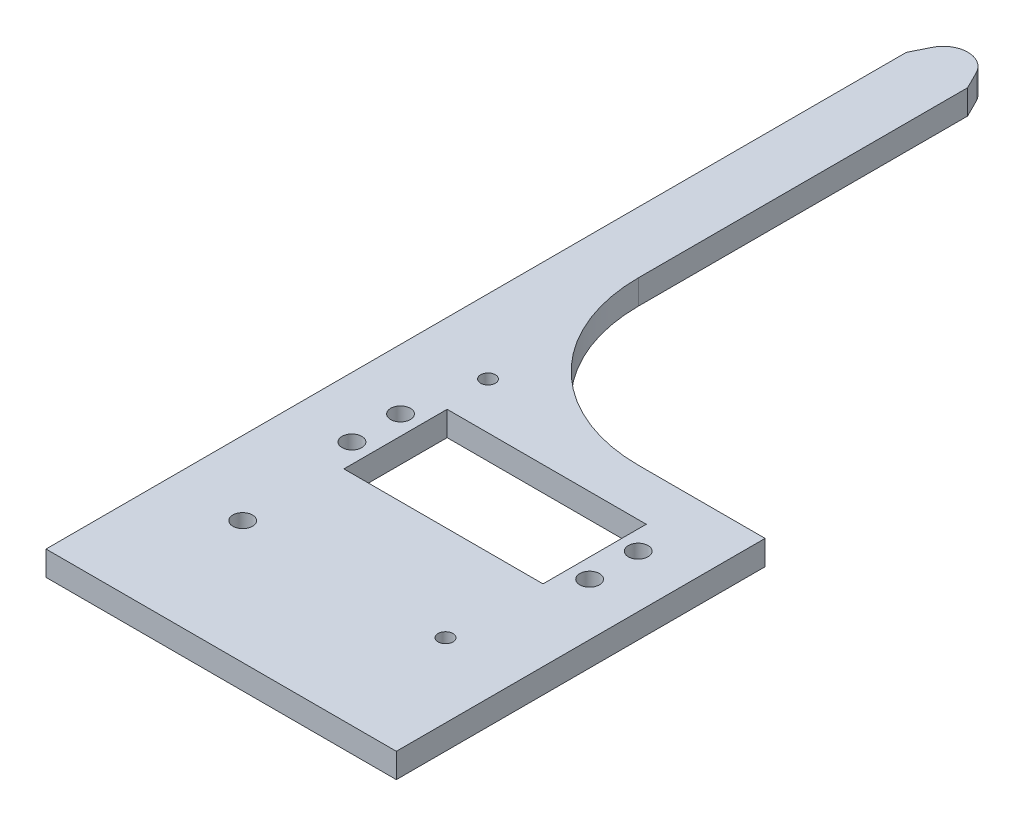
ISO-10303-21;
HEADER;
FILE_DESCRIPTION(('STEP AP214'),'2;1');
FILE_NAME('part.step','',(''),(''),'','','');
FILE_SCHEMA(('AUTOMOTIVE_DESIGN { 1 0 10303 214 1 1 1 1 }'));
ENDSEC;
DATA;
#1=APPLICATION_CONTEXT('core data for automotive mechanical design processes');
#2=APPLICATION_PROTOCOL_DEFINITION('international standard','automotive_design',2000,#1);
#3=PRODUCT_CONTEXT('',#1,'mechanical');
#4=PRODUCT('Part','Part','',(#3));
#5=PRODUCT_RELATED_PRODUCT_CATEGORY('part','',(#4));
#6=PRODUCT_DEFINITION_FORMATION('','',#4);
#7=PRODUCT_DEFINITION_CONTEXT('part definition',#1,'design');
#8=PRODUCT_DEFINITION('design','',#6,#7);
#9=PRODUCT_DEFINITION_SHAPE('','',#8);
#10=(LENGTH_UNIT() NAMED_UNIT(*) SI_UNIT(.MILLI.,.METRE.));
#11=(NAMED_UNIT(*) PLANE_ANGLE_UNIT() SI_UNIT($,.RADIAN.));
#12=(NAMED_UNIT(*) SI_UNIT($,.STERADIAN.) SOLID_ANGLE_UNIT());
#13=UNCERTAINTY_MEASURE_WITH_UNIT(LENGTH_MEASURE(1.E-05),#10,'distance_accuracy_value','');
#14=(GEOMETRIC_REPRESENTATION_CONTEXT(3) GLOBAL_UNCERTAINTY_ASSIGNED_CONTEXT((#13)) GLOBAL_UNIT_ASSIGNED_CONTEXT((#10,
#11,#12)) REPRESENTATION_CONTEXT('',''));
#15=CARTESIAN_POINT('',(0.,0.,0.));
#16=DIRECTION('',(0.,0.,1.));
#17=DIRECTION('',(1.,0.,0.));
#18=AXIS2_PLACEMENT_3D('',#15,#16,#17);
#19=CARTESIAN_POINT('',(0.,2.5,0.));
#20=DIRECTION('',(0.,1.,0.));
#21=DIRECTION('',(0.,0.,1.));
#22=AXIS2_PLACEMENT_3D('',#19,#20,#21);
#23=PLANE('',#22);
#24=DIRECTION('',(0.447213595499958,0.,0.894427190999916));
#25=VECTOR('',#24,1.);
#26=CARTESIAN_POINT('',(0.389719298062895,2.5,-0.194859649031447));
#27=LINE('',#26,#25);
#28=CARTESIAN_POINT('',(-34.7578640450004,2.5,-70.4900263351581));
#29=VERTEX_POINT('',#28);
#30=CARTESIAN_POINT('',(-33.,2.5,-66.9742982451572));
#31=VERTEX_POINT('',#30);
#32=EDGE_CURVE('E256',#29,#31,#27,.T.);
#33=ORIENTED_EDGE('',*,*,#32,.F.);
#34=CARTESIAN_POINT('',(-39.23,2.5,-68.2539583576583));
#35=DIRECTION('',(0.,1.,0.));
#36=DIRECTION('',(0.,0.,1.));
#37=AXIS2_PLACEMENT_3D('',#34,#35,#36);
#38=CIRCLE('',#37,5.);
#39=CARTESIAN_POINT('',(-43.7021359549996,2.5,-70.4900263351581));
#40=VERTEX_POINT('',#39);
#41=EDGE_CURVE('E11',#29,#40,#38,.T.);
#42=ORIENTED_EDGE('',*,*,#41,.T.);
#43=DIRECTION('',(0.447213595499958,0.,-0.894427190999916));
#44=VECTOR('',#43,1.);
#45=CARTESIAN_POINT('',(-63.1577192980629,2.5,-31.5788596490314));
#46=LINE('',#45,#44);
#47=CARTESIAN_POINT('',(-45.46,2.5,-66.9742982451572));
#48=VERTEX_POINT('',#47);
#49=EDGE_CURVE('E259',#48,#40,#46,.T.);
#50=ORIENTED_EDGE('',*,*,#49,.F.);
#51=DIRECTION('',(0.,0.,-1.));
#52=VECTOR('',#51,1.);
#53=CARTESIAN_POINT('',(-45.46,2.5,0.));
#54=LINE('',#53,#52);
#55=CARTESIAN_POINT('',(-45.46,2.5,-13.2677945910564));
#56=VERTEX_POINT('',#55);
#57=EDGE_CURVE('E263',#56,#48,#54,.T.);
#58=ORIENTED_EDGE('',*,*,#57,.F.);
#59=DIRECTION('',(1.,0.,0.));
#60=VECTOR('',#59,1.);
#61=CARTESIAN_POINT('',(0.,2.5,-13.2677945910564));
#62=LINE('',#61,#60);
#63=CARTESIAN_POINT('',(-45.4667335164913,2.5,-13.2677945910564));
#64=VERTEX_POINT('',#63);
#65=EDGE_CURVE('E267',#64,#56,#62,.T.);
#66=ORIENTED_EDGE('',*,*,#65,.F.);
#67=DIRECTION('',(0.,0.,1.));
#68=VECTOR('',#67,1.);
#69=CARTESIAN_POINT('',(-45.4667335164913,2.5,0.));
#70=LINE('',#69,#68);
#71=CARTESIAN_POINT('',(-45.4667335164913,2.5,107.999697870866));
#72=VERTEX_POINT('',#71);
#73=EDGE_CURVE('E271',#64,#72,#70,.T.);
#74=ORIENTED_EDGE('',*,*,#73,.T.);
#75=DIRECTION('',(1.,0.,0.));
#76=VECTOR('',#75,1.);
#77=CARTESIAN_POINT('',(0.,2.5,107.999697870866));
#78=LINE('',#77,#76);
#79=CARTESIAN_POINT('',(25.786244138034,2.5,107.999697870866));
#80=VERTEX_POINT('',#79);
#81=EDGE_CURVE('E236',#72,#80,#78,.T.);
#82=ORIENTED_EDGE('',*,*,#81,.T.);
#83=DIRECTION('',(0.,0.,1.));
#84=VECTOR('',#83,1.);
#85=CARTESIAN_POINT('',(25.786244138034,2.5,0.));
#86=LINE('',#85,#84);
#87=CARTESIAN_POINT('',(25.786244138034,2.5,33.));
#88=VERTEX_POINT('',#87);
#89=EDGE_CURVE('E239',#88,#80,#86,.T.);
#90=ORIENTED_EDGE('',*,*,#89,.F.);
#91=DIRECTION('',(1.,0.,0.));
#92=VECTOR('',#91,1.);
#93=CARTESIAN_POINT('',(0.,2.5,33.));
#94=LINE('',#93,#92);
#95=CARTESIAN_POINT('',(0.,2.5,33.));
#96=VERTEX_POINT('',#95);
#97=EDGE_CURVE('E244',#96,#88,#94,.T.);
#98=ORIENTED_EDGE('',*,*,#97,.F.);
#99=CARTESIAN_POINT('',(0.,2.5,0.));
#100=DIRECTION('',(0.,1.,0.));
#101=DIRECTION('',(0.,0.,1.));
#102=AXIS2_PLACEMENT_3D('',#99,#100,#101);
#103=CIRCLE('',#102,33.);
#104=CARTESIAN_POINT('',(-33.,2.5,0.));
#105=VERTEX_POINT('',#104);
#106=EDGE_CURVE('E248',#105,#96,#103,.T.);
#107=ORIENTED_EDGE('',*,*,#106,.F.);
#108=DIRECTION('',(0.,0.,-1.));
#109=VECTOR('',#108,1.);
#110=CARTESIAN_POINT('',(-33.,2.5,0.));
#111=LINE('',#110,#109);
#112=EDGE_CURVE('E252',#105,#31,#111,.T.);
#113=ORIENTED_EDGE('',*,*,#112,.T.);
#114=EDGE_LOOP('',(#33,#42,#50,#58,#66,#74,#82,#90,#98,#107,#113));
#115=FACE_BOUND('',#114,.T.);
#116=CARTESIAN_POINT('',(15.1337546040341,2.5,48.1554812664315));
#117=DIRECTION('',(0.,1.,0.));
#118=DIRECTION('',(0.,0.,1.));
#119=AXIS2_PLACEMENT_3D('',#116,#117,#118);
#120=CIRCLE('',#119,2.);
#121=CARTESIAN_POINT('',(15.1337546040341,2.5,50.1554812664315));
#122=VERTEX_POINT('',#121);
#123=EDGE_CURVE('E757',#122,#122,#120,.F.);
#124=ORIENTED_EDGE('',*,*,#123,.T.);
#125=EDGE_LOOP('',(#124));
#126=FACE_BOUND('',#125,.T.);
#127=CARTESIAN_POINT('',(15.1337546040341,2.5,58.0354812664315));
#128=DIRECTION('',(0.,1.,0.));
#129=DIRECTION('',(0.,0.,1.));
#130=AXIS2_PLACEMENT_3D('',#127,#128,#129);
#131=CIRCLE('',#130,2.);
#132=CARTESIAN_POINT('',(15.1337546040341,2.5,60.0354812664315));
#133=VERTEX_POINT('',#132);
#134=EDGE_CURVE('E764',#133,#133,#131,.T.);
#135=ORIENTED_EDGE('',*,*,#134,.F.);
#136=EDGE_LOOP('',(#135));
#137=FACE_BOUND('',#136,.T.);
#138=CARTESIAN_POINT('',(-33.2062453959659,2.5,48.1554812664315));
#139=DIRECTION('',(0.,1.,0.));
#140=DIRECTION('',(0.,0.,1.));
#141=AXIS2_PLACEMENT_3D('',#138,#139,#140);
#142=CIRCLE('',#141,2.);
#143=CARTESIAN_POINT('',(-33.2062453959659,2.5,50.1554812664315));
#144=VERTEX_POINT('',#143);
#145=EDGE_CURVE('E190',#144,#144,#142,.T.);
#146=ORIENTED_EDGE('',*,*,#145,.F.);
#147=EDGE_LOOP('',(#146));
#148=FACE_BOUND('',#147,.T.);
#149=DIRECTION('',(-1.,0.,0.));
#150=VECTOR('',#149,1.);
#151=CARTESIAN_POINT('',(-29.2862453959659,2.5,42.5954812664315));
#152=LINE('',#151,#150);
#153=CARTESIAN_POINT('',(11.2137546040341,2.5,42.5954812664315));
#154=VERTEX_POINT('',#153);
#155=CARTESIAN_POINT('',(-29.2862453959659,2.5,42.5954812664315));
#156=VERTEX_POINT('',#155);
#157=EDGE_CURVE('E179',#154,#156,#152,.T.);
#158=ORIENTED_EDGE('',*,*,#157,.F.);
#159=DIRECTION('',(0.,0.,-1.));
#160=VECTOR('',#159,1.);
#161=CARTESIAN_POINT('',(11.2137546040341,2.5,42.5954812664315));
#162=LINE('',#161,#160);
#163=CARTESIAN_POINT('',(11.2137546040341,2.5,63.5954812664315));
#164=VERTEX_POINT('',#163);
#165=EDGE_CURVE('E172',#164,#154,#162,.T.);
#166=ORIENTED_EDGE('',*,*,#165,.F.);
#167=DIRECTION('',(1.,0.,0.));
#168=VECTOR('',#167,1.);
#169=CARTESIAN_POINT('',(-29.2862453959659,2.5,63.5954812664315));
#170=LINE('',#169,#168);
#171=CARTESIAN_POINT('',(-29.2862453959659,2.5,63.5954812664315));
#172=VERTEX_POINT('',#171);
#173=EDGE_CURVE('E154',#172,#164,#170,.T.);
#174=ORIENTED_EDGE('',*,*,#173,.F.);
#175=DIRECTION('',(0.,0.,1.));
#176=VECTOR('',#175,1.);
#177=CARTESIAN_POINT('',(-29.2862453959659,2.5,42.5954812664315));
#178=LINE('',#177,#176);
#179=EDGE_CURVE('E201',#156,#172,#178,.T.);
#180=ORIENTED_EDGE('',*,*,#179,.F.);
#181=EDGE_LOOP('',(#158,#166,#174,#180));
#182=FACE_BOUND('',#181,.T.);
#183=CARTESIAN_POINT('',(10.786244138034,2.5,82.9996978708664));
#184=DIRECTION('',(0.,1.,0.));
#185=DIRECTION('',(0.,0.,1.));
#186=AXIS2_PLACEMENT_3D('',#183,#184,#185);
#187=CIRCLE('',#186,1.5);
#188=CARTESIAN_POINT('',(10.786244138034,2.5,84.4996978708664));
#189=VERTEX_POINT('',#188);
#190=EDGE_CURVE('E202',#189,#189,#187,.T.);
#191=ORIENTED_EDGE('',*,*,#190,.F.);
#192=EDGE_LOOP('',(#191));
#193=FACE_BOUND('',#192,.T.);
#194=CARTESIAN_POINT('',(-30.4667335164913,2.5,82.9996978708664));
#195=DIRECTION('',(0.,1.,0.));
#196=DIRECTION('',(0.,0.,1.));
#197=AXIS2_PLACEMENT_3D('',#194,#195,#196);
#198=CIRCLE('',#197,2.00000000000001);
#199=CARTESIAN_POINT('',(-30.4667335164913,2.5,84.9996978708664));
#200=VERTEX_POINT('',#199);
#201=EDGE_CURVE('E206',#200,#200,#198,.T.);
#202=ORIENTED_EDGE('',*,*,#201,.F.);
#203=EDGE_LOOP('',(#202));
#204=FACE_BOUND('',#203,.T.);
#205=CARTESIAN_POINT('',(-30.4667335164913,2.5,33.0954812664315));
#206=DIRECTION('',(0.,1.,0.));
#207=DIRECTION('',(0.,0.,1.));
#208=AXIS2_PLACEMENT_3D('',#205,#206,#207);
#209=CIRCLE('',#208,1.5);
#210=CARTESIAN_POINT('',(-30.4667335164913,2.5,34.5954812664315));
#211=VERTEX_POINT('',#210);
#212=EDGE_CURVE('E214',#211,#211,#209,.T.);
#213=ORIENTED_EDGE('',*,*,#212,.F.);
#214=EDGE_LOOP('',(#213));
#215=FACE_BOUND('',#214,.T.);
#216=CARTESIAN_POINT('',(-33.2062453959659,2.5,58.0354812664315));
#217=DIRECTION('',(0.,1.,0.));
#218=DIRECTION('',(0.,0.,1.));
#219=AXIS2_PLACEMENT_3D('',#216,#217,#218);
#220=CIRCLE('',#219,2.);
#221=CARTESIAN_POINT('',(-33.2062453959659,2.5,60.0354812664315));
#222=VERTEX_POINT('',#221);
#223=EDGE_CURVE('E763',#222,#222,#220,.F.);
#224=ORIENTED_EDGE('',*,*,#223,.T.);
#225=EDGE_LOOP('',(#224));
#226=FACE_BOUND('',#225,.T.);
#227=ADVANCED_FACE('F47',(#115,#126,#137,#148,#182,#193,#204,#215,#226),#23,.T.);
#228=CARTESIAN_POINT('',(0.,-2.5,0.));
#229=DIRECTION('',(0.,1.,0.));
#230=DIRECTION('',(0.,0.,1.));
#231=AXIS2_PLACEMENT_3D('',#228,#229,#230);
#232=PLANE('',#231);
#233=CARTESIAN_POINT('',(15.1337546040341,-2.5,58.0354812664315));
#234=DIRECTION('',(0.,1.,0.));
#235=DIRECTION('',(0.,0.,1.));
#236=AXIS2_PLACEMENT_3D('',#233,#234,#235);
#237=CIRCLE('',#236,2.);
#238=CARTESIAN_POINT('',(15.1337546040341,-2.5,60.0354812664315));
#239=VERTEX_POINT('',#238);
#240=EDGE_CURVE('E349',#239,#239,#237,.T.);
#241=ORIENTED_EDGE('',*,*,#240,.T.);
#242=EDGE_LOOP('',(#241));
#243=FACE_BOUND('',#242,.T.);
#244=CARTESIAN_POINT('',(-33.2062453959659,-2.5,48.1554812664315));
#245=DIRECTION('',(0.,1.,0.));
#246=DIRECTION('',(0.,0.,1.));
#247=AXIS2_PLACEMENT_3D('',#244,#245,#246);
#248=CIRCLE('',#247,2.);
#249=CARTESIAN_POINT('',(-33.2062453959659,-2.5,50.1554812664315));
#250=VERTEX_POINT('',#249);
#251=EDGE_CURVE('E345',#250,#250,#248,.T.);
#252=ORIENTED_EDGE('',*,*,#251,.T.);
#253=EDGE_LOOP('',(#252));
#254=FACE_BOUND('',#253,.T.);
#255=DIRECTION('',(0.,0.,-1.));
#256=VECTOR('',#255,1.);
#257=CARTESIAN_POINT('',(11.2137546040341,-2.5,0.));
#258=LINE('',#257,#256);
#259=CARTESIAN_POINT('',(11.2137546040341,-2.5,63.5954812664315));
#260=VERTEX_POINT('',#259);
#261=CARTESIAN_POINT('',(11.2137546040341,-2.5,42.5954812664315));
#262=VERTEX_POINT('',#261);
#263=EDGE_CURVE('E174',#260,#262,#258,.T.);
#264=ORIENTED_EDGE('',*,*,#263,.T.);
#265=DIRECTION('',(-1.,0.,0.));
#266=VECTOR('',#265,1.);
#267=CARTESIAN_POINT('',(-29.2862453959659,-2.5,42.5954812664315));
#268=LINE('',#267,#266);
#269=CARTESIAN_POINT('',(-29.2862453959659,-2.5,42.5954812664315));
#270=VERTEX_POINT('',#269);
#271=EDGE_CURVE('E224',#262,#270,#268,.T.);
#272=ORIENTED_EDGE('',*,*,#271,.T.);
#273=DIRECTION('',(0.,0.,1.));
#274=VECTOR('',#273,1.);
#275=CARTESIAN_POINT('',(-29.2862453959659,-2.5,42.5954812664315));
#276=LINE('',#275,#274);
#277=CARTESIAN_POINT('',(-29.2862453959659,-2.5,63.5954812664315));
#278=VERTEX_POINT('',#277);
#279=EDGE_CURVE('E221',#270,#278,#276,.T.);
#280=ORIENTED_EDGE('',*,*,#279,.T.);
#281=DIRECTION('',(1.,0.,0.));
#282=VECTOR('',#281,1.);
#283=CARTESIAN_POINT('',(0.,-2.5,63.5954812664315));
#284=LINE('',#283,#282);
#285=EDGE_CURVE('E339',#278,#260,#284,.T.);
#286=ORIENTED_EDGE('',*,*,#285,.T.);
#287=EDGE_LOOP('',(#264,#272,#280,#286));
#288=FACE_BOUND('',#287,.T.);
#289=CARTESIAN_POINT('',(10.786244138034,-2.5,82.9996978708664));
#290=DIRECTION('',(0.,1.,0.));
#291=DIRECTION('',(0.,0.,1.));
#292=AXIS2_PLACEMENT_3D('',#289,#290,#291);
#293=CIRCLE('',#292,1.5);
#294=CARTESIAN_POINT('',(10.786244138034,-2.5,84.4996978708664));
#295=VERTEX_POINT('',#294);
#296=EDGE_CURVE('E197',#295,#295,#293,.T.);
#297=ORIENTED_EDGE('',*,*,#296,.T.);
#298=EDGE_LOOP('',(#297));
#299=FACE_BOUND('',#298,.T.);
#300=CARTESIAN_POINT('',(-30.4667335164913,-2.5,82.9996978708664));
#301=DIRECTION('',(0.,1.,0.));
#302=DIRECTION('',(0.,0.,1.));
#303=AXIS2_PLACEMENT_3D('',#300,#301,#302);
#304=CIRCLE('',#303,2.00000000000001);
#305=CARTESIAN_POINT('',(-30.4667335164913,-2.5,84.9996978708664));
#306=VERTEX_POINT('',#305);
#307=EDGE_CURVE('E210',#306,#306,#304,.T.);
#308=ORIENTED_EDGE('',*,*,#307,.T.);
#309=EDGE_LOOP('',(#308));
#310=FACE_BOUND('',#309,.T.);
#311=CARTESIAN_POINT('',(-30.4667335164913,-2.5,33.0954812664315));
#312=DIRECTION('',(0.,1.,0.));
#313=DIRECTION('',(0.,0.,1.));
#314=AXIS2_PLACEMENT_3D('',#311,#312,#313);
#315=CIRCLE('',#314,1.5);
#316=CARTESIAN_POINT('',(-30.4667335164913,-2.5,34.5954812664315));
#317=VERTEX_POINT('',#316);
#318=EDGE_CURVE('E196',#317,#317,#315,.T.);
#319=ORIENTED_EDGE('',*,*,#318,.T.);
#320=EDGE_LOOP('',(#319));
#321=FACE_BOUND('',#320,.T.);
#322=DIRECTION('',(0.447213595499958,0.,-0.894427190999916));
#323=VECTOR('',#322,1.);
#324=CARTESIAN_POINT('',(-63.1577192980629,-2.5,-31.5788596490314));
#325=LINE('',#324,#323);
#326=CARTESIAN_POINT('',(-45.46,-2.5,-66.9742982451572));
#327=VERTEX_POINT('',#326);
#328=CARTESIAN_POINT('',(-43.7021359549996,-2.5,-70.4900263351581));
#329=VERTEX_POINT('',#328);
#330=EDGE_CURVE('E297',#327,#329,#325,.T.);
#331=ORIENTED_EDGE('',*,*,#330,.T.);
#332=CARTESIAN_POINT('',(-39.23,-2.5,-68.2539583576583));
#333=DIRECTION('',(0.,1.,0.));
#334=DIRECTION('',(0.,0.,1.));
#335=AXIS2_PLACEMENT_3D('',#332,#333,#334);
#336=CIRCLE('',#335,5.);
#337=CARTESIAN_POINT('',(-34.7578640450004,-2.5,-70.4900263351581));
#338=VERTEX_POINT('',#337);
#339=EDGE_CURVE('E70',#329,#338,#336,.F.);
#340=ORIENTED_EDGE('',*,*,#339,.T.);
#341=DIRECTION('',(0.447213595499958,0.,0.894427190999916));
#342=VECTOR('',#341,1.);
#343=CARTESIAN_POINT('',(0.389719298062895,-2.5,-0.194859649031447));
#344=LINE('',#343,#342);
#345=CARTESIAN_POINT('',(-33.,-2.5,-66.9742982451572));
#346=VERTEX_POINT('',#345);
#347=EDGE_CURVE('E294',#338,#346,#344,.T.);
#348=ORIENTED_EDGE('',*,*,#347,.T.);
#349=DIRECTION('',(0.,0.,-1.));
#350=VECTOR('',#349,1.);
#351=CARTESIAN_POINT('',(-33.,-2.5,0.));
#352=LINE('',#351,#350);
#353=CARTESIAN_POINT('',(-33.,-2.5,0.));
#354=VERTEX_POINT('',#353);
#355=EDGE_CURVE('E290',#354,#346,#352,.T.);
#356=ORIENTED_EDGE('',*,*,#355,.F.);
#357=CARTESIAN_POINT('',(0.,-2.5,0.));
#358=DIRECTION('',(0.,1.,0.));
#359=DIRECTION('',(0.,0.,1.));
#360=AXIS2_PLACEMENT_3D('',#357,#358,#359);
#361=CIRCLE('',#360,33.);
#362=CARTESIAN_POINT('',(0.,-2.5,33.));
#363=VERTEX_POINT('',#362);
#364=EDGE_CURVE('E286',#354,#363,#361,.T.);
#365=ORIENTED_EDGE('',*,*,#364,.T.);
#366=DIRECTION('',(1.,0.,0.));
#367=VECTOR('',#366,1.);
#368=CARTESIAN_POINT('',(0.,-2.5,33.));
#369=LINE('',#368,#367);
#370=CARTESIAN_POINT('',(25.786244138034,-2.5,33.));
#371=VERTEX_POINT('',#370);
#372=EDGE_CURVE('E282',#363,#371,#369,.T.);
#373=ORIENTED_EDGE('',*,*,#372,.T.);
#374=DIRECTION('',(0.,0.,1.));
#375=VECTOR('',#374,1.);
#376=CARTESIAN_POINT('',(25.786244138034,-2.5,0.));
#377=LINE('',#376,#375);
#378=CARTESIAN_POINT('',(25.786244138034,-2.5,107.999697870866));
#379=VERTEX_POINT('',#378);
#380=EDGE_CURVE('E278',#371,#379,#377,.T.);
#381=ORIENTED_EDGE('',*,*,#380,.T.);
#382=DIRECTION('',(1.,0.,0.));
#383=VECTOR('',#382,1.);
#384=CARTESIAN_POINT('',(0.,-2.5,107.999697870866));
#385=LINE('',#384,#383);
#386=CARTESIAN_POINT('',(-45.4667335164913,-2.5,107.999697870866));
#387=VERTEX_POINT('',#386);
#388=EDGE_CURVE('E235',#387,#379,#385,.T.);
#389=ORIENTED_EDGE('',*,*,#388,.F.);
#390=DIRECTION('',(0.,0.,1.));
#391=VECTOR('',#390,1.);
#392=CARTESIAN_POINT('',(-45.4667335164913,-2.5,0.));
#393=LINE('',#392,#391);
#394=CARTESIAN_POINT('',(-45.4667335164913,-2.5,-13.2677945910564));
#395=VERTEX_POINT('',#394);
#396=EDGE_CURVE('E240',#395,#387,#393,.T.);
#397=ORIENTED_EDGE('',*,*,#396,.F.);
#398=DIRECTION('',(1.,0.,0.));
#399=VECTOR('',#398,1.);
#400=CARTESIAN_POINT('',(0.,-2.5,-13.2677945910564));
#401=LINE('',#400,#399);
#402=CARTESIAN_POINT('',(-45.46,-2.5,-13.2677945910564));
#403=VERTEX_POINT('',#402);
#404=EDGE_CURVE('E304',#395,#403,#401,.T.);
#405=ORIENTED_EDGE('',*,*,#404,.T.);
#406=DIRECTION('',(0.,0.,-1.));
#407=VECTOR('',#406,1.);
#408=CARTESIAN_POINT('',(-45.46,-2.5,0.));
#409=LINE('',#408,#407);
#410=EDGE_CURVE('E300',#403,#327,#409,.T.);
#411=ORIENTED_EDGE('',*,*,#410,.T.);
#412=EDGE_LOOP('',(#331,#340,#348,#356,#365,#373,#381,#389,#397,#405,#411));
#413=FACE_BOUND('',#412,.T.);
#414=CARTESIAN_POINT('',(15.1337546040341,-2.5,48.1554812664315));
#415=DIRECTION('',(0.,1.,0.));
#416=DIRECTION('',(0.,0.,1.));
#417=AXIS2_PLACEMENT_3D('',#414,#415,#416);
#418=CIRCLE('',#417,2.);
#419=CARTESIAN_POINT('',(15.1337546040341,-2.5,50.1554812664315));
#420=VERTEX_POINT('',#419);
#421=EDGE_CURVE('E186',#420,#420,#418,.F.);
#422=ORIENTED_EDGE('',*,*,#421,.F.);
#423=EDGE_LOOP('',(#422));
#424=FACE_BOUND('',#423,.T.);
#425=CARTESIAN_POINT('',(-33.2062453959659,-2.5,58.0354812664315));
#426=DIRECTION('',(0.,1.,0.));
#427=DIRECTION('',(0.,0.,1.));
#428=AXIS2_PLACEMENT_3D('',#425,#426,#427);
#429=CIRCLE('',#428,2.);
#430=CARTESIAN_POINT('',(-33.2062453959659,-2.5,60.0354812664315));
#431=VERTEX_POINT('',#430);
#432=EDGE_CURVE('E182',#431,#431,#429,.F.);
#433=ORIENTED_EDGE('',*,*,#432,.F.);
#434=EDGE_LOOP('',(#433));
#435=FACE_BOUND('',#434,.T.);
#436=ADVANCED_FACE('F368',(#243,#254,#288,#299,#310,#321,#413,#424,#435),#232,.F.);
#437=CARTESIAN_POINT('',(0.,2.5,107.999697870866));
#438=DIRECTION('',(0.,0.,-1.));
#439=DIRECTION('',(-1.,0.,0.));
#440=AXIS2_PLACEMENT_3D('',#437,#438,#439);
#441=PLANE('',#440);
#442=ORIENTED_EDGE('',*,*,#388,.T.);
#443=DIRECTION('',(0.,-1.,0.));
#444=VECTOR('',#443,1.);
#445=CARTESIAN_POINT('',(25.786244138034,2.5,107.999697870866));
#446=LINE('',#445,#444);
#447=EDGE_CURVE('E336',#80,#379,#446,.T.);
#448=ORIENTED_EDGE('',*,*,#447,.F.);
#449=ORIENTED_EDGE('',*,*,#81,.F.);
#450=DIRECTION('',(0.,-1.,0.));
#451=VECTOR('',#450,1.);
#452=CARTESIAN_POINT('',(-45.4667335164913,2.5,107.999697870866));
#453=LINE('',#452,#451);
#454=EDGE_CURVE('E274',#72,#387,#453,.T.);
#455=ORIENTED_EDGE('',*,*,#454,.T.);
#456=EDGE_LOOP('',(#442,#448,#449,#455));
#457=FACE_BOUND('',#456,.T.);
#458=ADVANCED_FACE('F392',(#457),#441,.F.);
#459=CARTESIAN_POINT('',(25.786244138034,2.5,0.));
#460=DIRECTION('',(1.,0.,0.));
#461=DIRECTION('',(0.,0.,-1.));
#462=AXIS2_PLACEMENT_3D('',#459,#460,#461);
#463=PLANE('',#462);
#464=ORIENTED_EDGE('',*,*,#380,.F.);
#465=DIRECTION('',(0.,-1.,0.));
#466=VECTOR('',#465,1.);
#467=CARTESIAN_POINT('',(25.786244138034,2.5,33.));
#468=LINE('',#467,#466);
#469=EDGE_CURVE('E333',#88,#371,#468,.T.);
#470=ORIENTED_EDGE('',*,*,#469,.F.);
#471=ORIENTED_EDGE('',*,*,#89,.T.);
#472=ORIENTED_EDGE('',*,*,#447,.T.);
#473=EDGE_LOOP('',(#464,#470,#471,#472));
#474=FACE_BOUND('',#473,.T.);
#475=ADVANCED_FACE('F425',(#474),#463,.T.);
#476=CARTESIAN_POINT('',(0.,2.5,33.));
#477=DIRECTION('',(0.,0.,-1.));
#478=DIRECTION('',(-1.,0.,0.));
#479=AXIS2_PLACEMENT_3D('',#476,#477,#478);
#480=PLANE('',#479);
#481=ORIENTED_EDGE('',*,*,#372,.F.);
#482=DIRECTION('',(0.,-1.,0.));
#483=VECTOR('',#482,1.);
#484=CARTESIAN_POINT('',(0.,2.5,33.));
#485=LINE('',#484,#483);
#486=EDGE_CURVE('E330',#96,#363,#485,.T.);
#487=ORIENTED_EDGE('',*,*,#486,.F.);
#488=ORIENTED_EDGE('',*,*,#97,.T.);
#489=ORIENTED_EDGE('',*,*,#469,.T.);
#490=EDGE_LOOP('',(#481,#487,#488,#489));
#491=FACE_BOUND('',#490,.T.);
#492=ADVANCED_FACE('F421',(#491),#480,.T.);
#493=CARTESIAN_POINT('',(0.,2.5,0.));
#494=DIRECTION('',(0.,-1.,0.));
#495=DIRECTION('',(0.,0.,-1.));
#496=AXIS2_PLACEMENT_3D('',#493,#494,#495);
#497=CYLINDRICAL_SURFACE('',#496,33.);
#498=ORIENTED_EDGE('',*,*,#364,.F.);
#499=DIRECTION('',(0.,-1.,0.));
#500=VECTOR('',#499,1.);
#501=CARTESIAN_POINT('',(-33.,2.5,0.));
#502=LINE('',#501,#500);
#503=EDGE_CURVE('E326',#105,#354,#502,.T.);
#504=ORIENTED_EDGE('',*,*,#503,.F.);
#505=ORIENTED_EDGE('',*,*,#106,.T.);
#506=ORIENTED_EDGE('',*,*,#486,.T.);
#507=EDGE_LOOP('',(#498,#504,#505,#506));
#508=FACE_BOUND('',#507,.T.);
#509=ADVANCED_FACE('F417',(#508),#497,.F.);
#510=CARTESIAN_POINT('',(-33.,2.5,0.));
#511=DIRECTION('',(-1.,0.,0.));
#512=DIRECTION('',(0.,0.,1.));
#513=AXIS2_PLACEMENT_3D('',#510,#511,#512);
#514=PLANE('',#513);
#515=DIRECTION('',(0.,-1.,0.));
#516=VECTOR('',#515,1.);
#517=CARTESIAN_POINT('',(-33.,2.5,-66.9742982451572));
#518=LINE('',#517,#516);
#519=EDGE_CURVE('E322',#31,#346,#518,.T.);
#520=ORIENTED_EDGE('',*,*,#519,.F.);
#521=ORIENTED_EDGE('',*,*,#112,.F.);
#522=ORIENTED_EDGE('',*,*,#503,.T.);
#523=ORIENTED_EDGE('',*,*,#355,.T.);
#524=EDGE_LOOP('',(#520,#521,#522,#523));
#525=FACE_BOUND('',#524,.T.);
#526=ADVANCED_FACE('F414',(#525),#514,.F.);
#527=CARTESIAN_POINT('',(0.389719298062895,2.5,-0.194859649031447));
#528=DIRECTION('',(0.894427190999916,0.,-0.447213595499958));
#529=DIRECTION('',(-0.447213595499958,0.,-0.894427190999916));
#530=AXIS2_PLACEMENT_3D('',#527,#528,#529);
#531=PLANE('',#530);
#532=ORIENTED_EDGE('',*,*,#347,.F.);
#533=DIRECTION('',(0.,-1.,0.));
#534=VECTOR('',#533,1.);
#535=CARTESIAN_POINT('',(-34.7578640450004,2.5,-70.4900263351581));
#536=LINE('',#535,#534);
#537=EDGE_CURVE('E56',#338,#29,#536,.F.);
#538=ORIENTED_EDGE('',*,*,#537,.T.);
#539=ORIENTED_EDGE('',*,*,#32,.T.);
#540=ORIENTED_EDGE('',*,*,#519,.T.);
#541=EDGE_LOOP('',(#532,#538,#539,#540));
#542=FACE_BOUND('',#541,.T.);
#543=ADVANCED_FACE('F411',(#542),#531,.T.);
#544=CARTESIAN_POINT('',(-63.1577192980629,2.5,-31.5788596490314));
#545=DIRECTION('',(-0.894427190999916,0.,-0.447213595499958));
#546=DIRECTION('',(-0.447213595499958,0.,0.894427190999916));
#547=AXIS2_PLACEMENT_3D('',#544,#545,#546);
#548=PLANE('',#547);
#549=ORIENTED_EDGE('',*,*,#49,.T.);
#550=DIRECTION('',(0.,-1.,0.));
#551=VECTOR('',#550,1.);
#552=CARTESIAN_POINT('',(-43.7021359549996,2.5,-70.4900263351581));
#553=LINE('',#552,#551);
#554=EDGE_CURVE('E344',#40,#329,#553,.T.);
#555=ORIENTED_EDGE('',*,*,#554,.T.);
#556=ORIENTED_EDGE('',*,*,#330,.F.);
#557=DIRECTION('',(0.,-1.,0.));
#558=VECTOR('',#557,1.);
#559=CARTESIAN_POINT('',(-45.46,2.5,-66.9742982451572));
#560=LINE('',#559,#558);
#561=EDGE_CURVE('E319',#48,#327,#560,.T.);
#562=ORIENTED_EDGE('',*,*,#561,.F.);
#563=EDGE_LOOP('',(#549,#555,#556,#562));
#564=FACE_BOUND('',#563,.T.);
#565=ADVANCED_FACE('F364',(#564),#548,.T.);
#566=CARTESIAN_POINT('',(-45.46,2.5,0.));
#567=DIRECTION('',(-1.,0.,0.));
#568=DIRECTION('',(0.,0.,1.));
#569=AXIS2_PLACEMENT_3D('',#566,#567,#568);
#570=PLANE('',#569);
#571=ORIENTED_EDGE('',*,*,#410,.F.);
#572=DIRECTION('',(0.,-1.,0.));
#573=VECTOR('',#572,1.);
#574=CARTESIAN_POINT('',(-45.46,2.5,-13.2677945910564));
#575=LINE('',#574,#573);
#576=EDGE_CURVE('E316',#56,#403,#575,.T.);
#577=ORIENTED_EDGE('',*,*,#576,.F.);
#578=ORIENTED_EDGE('',*,*,#57,.T.);
#579=ORIENTED_EDGE('',*,*,#561,.T.);
#580=EDGE_LOOP('',(#571,#577,#578,#579));
#581=FACE_BOUND('',#580,.T.);
#582=ADVANCED_FACE('F374',(#581),#570,.T.);
#583=CARTESIAN_POINT('',(0.,2.5,-13.2677945910564));
#584=DIRECTION('',(0.,0.,-1.));
#585=DIRECTION('',(-1.,0.,0.));
#586=AXIS2_PLACEMENT_3D('',#583,#584,#585);
#587=PLANE('',#586);
#588=ORIENTED_EDGE('',*,*,#404,.F.);
#589=DIRECTION('',(0.,-1.,0.));
#590=VECTOR('',#589,1.);
#591=CARTESIAN_POINT('',(-45.4667335164913,2.5,-13.2677945910564));
#592=LINE('',#591,#590);
#593=EDGE_CURVE('E313',#64,#395,#592,.T.);
#594=ORIENTED_EDGE('',*,*,#593,.F.);
#595=ORIENTED_EDGE('',*,*,#65,.T.);
#596=ORIENTED_EDGE('',*,*,#576,.T.);
#597=EDGE_LOOP('',(#588,#594,#595,#596));
#598=FACE_BOUND('',#597,.T.);
#599=ADVANCED_FACE('F402',(#598),#587,.T.);
#600=CARTESIAN_POINT('',(-45.4667335164913,2.5,0.));
#601=DIRECTION('',(1.,0.,0.));
#602=DIRECTION('',(0.,0.,-1.));
#603=AXIS2_PLACEMENT_3D('',#600,#601,#602);
#604=PLANE('',#603);
#605=ORIENTED_EDGE('',*,*,#396,.T.);
#606=ORIENTED_EDGE('',*,*,#454,.F.);
#607=ORIENTED_EDGE('',*,*,#73,.F.);
#608=ORIENTED_EDGE('',*,*,#593,.T.);
#609=EDGE_LOOP('',(#605,#606,#607,#608));
#610=FACE_BOUND('',#609,.T.);
#611=ADVANCED_FACE('F399',(#610),#604,.F.);
#612=CARTESIAN_POINT('',(-29.2862453959659,-2.5,42.5954812664315));
#613=DIRECTION('',(-1.,0.,0.));
#614=DIRECTION('',(0.,0.,1.));
#615=AXIS2_PLACEMENT_3D('',#612,#613,#614);
#616=PLANE('',#615);
#617=ORIENTED_EDGE('',*,*,#179,.T.);
#618=DIRECTION('',(0.,1.,0.));
#619=VECTOR('',#618,1.);
#620=CARTESIAN_POINT('',(-29.2862453959659,-7.5,63.5954812664315));
#621=LINE('',#620,#619);
#622=EDGE_CURVE('E160',#278,#172,#621,.T.);
#623=ORIENTED_EDGE('',*,*,#622,.F.);
#624=ORIENTED_EDGE('',*,*,#279,.F.);
#625=DIRECTION('',(0.,1.,0.));
#626=VECTOR('',#625,1.);
#627=CARTESIAN_POINT('',(-29.2862453959659,-2.5,42.5954812664315));
#628=LINE('',#627,#626);
#629=EDGE_CURVE('E228',#270,#156,#628,.T.);
#630=ORIENTED_EDGE('',*,*,#629,.T.);
#631=EDGE_LOOP('',(#617,#623,#624,#630));
#632=FACE_BOUND('',#631,.T.);
#633=ADVANCED_FACE('F396',(#632),#616,.F.);
#634=CARTESIAN_POINT('',(-29.2862453959659,-2.5,42.5954812664315));
#635=DIRECTION('',(0.,0.,-1.));
#636=DIRECTION('',(-1.,0.,0.));
#637=AXIS2_PLACEMENT_3D('',#634,#635,#636);
#638=PLANE('',#637);
#639=ORIENTED_EDGE('',*,*,#157,.T.);
#640=ORIENTED_EDGE('',*,*,#629,.F.);
#641=ORIENTED_EDGE('',*,*,#271,.F.);
#642=DIRECTION('',(0.,1.,0.));
#643=VECTOR('',#642,1.);
#644=CARTESIAN_POINT('',(11.2137546040341,-7.5,42.5954812664315));
#645=LINE('',#644,#643);
#646=EDGE_CURVE('E165',#262,#154,#645,.T.);
#647=ORIENTED_EDGE('',*,*,#646,.T.);
#648=EDGE_LOOP('',(#639,#640,#641,#647));
#649=FACE_BOUND('',#648,.T.);
#650=ADVANCED_FACE('F492',(#649),#638,.F.);
#651=CARTESIAN_POINT('',(-30.4667335164913,-2.5,33.0954812664315));
#652=DIRECTION('',(0.,1.,0.));
#653=DIRECTION('',(0.,0.,1.));
#654=AXIS2_PLACEMENT_3D('',#651,#652,#653);
#655=CYLINDRICAL_SURFACE('',#654,1.5);
#656=ORIENTED_EDGE('',*,*,#318,.F.);
#657=EDGE_LOOP('',(#656));
#658=FACE_BOUND('',#657,.T.);
#659=ORIENTED_EDGE('',*,*,#212,.T.);
#660=EDGE_LOOP('',(#659));
#661=FACE_BOUND('',#660,.T.);
#662=ADVANCED_FACE('F500',(#658,#661),#655,.F.);
#663=CARTESIAN_POINT('',(-30.4667335164913,-2.5,82.9996978708664));
#664=DIRECTION('',(0.,1.,0.));
#665=DIRECTION('',(0.,0.,1.));
#666=AXIS2_PLACEMENT_3D('',#663,#664,#665);
#667=CYLINDRICAL_SURFACE('',#666,2.00000000000001);
#668=ORIENTED_EDGE('',*,*,#307,.F.);
#669=EDGE_LOOP('',(#668));
#670=FACE_BOUND('',#669,.T.);
#671=ORIENTED_EDGE('',*,*,#201,.T.);
#672=EDGE_LOOP('',(#671));
#673=FACE_BOUND('',#672,.T.);
#674=ADVANCED_FACE('F507',(#670,#673),#667,.F.);
#675=CARTESIAN_POINT('',(10.786244138034,-2.5,82.9996978708664));
#676=DIRECTION('',(0.,1.,0.));
#677=DIRECTION('',(0.,0.,1.));
#678=AXIS2_PLACEMENT_3D('',#675,#676,#677);
#679=CYLINDRICAL_SURFACE('',#678,1.5);
#680=ORIENTED_EDGE('',*,*,#296,.F.);
#681=EDGE_LOOP('',(#680));
#682=FACE_BOUND('',#681,.T.);
#683=ORIENTED_EDGE('',*,*,#190,.T.);
#684=EDGE_LOOP('',(#683));
#685=FACE_BOUND('',#684,.T.);
#686=ADVANCED_FACE('F515',(#682,#685),#679,.F.);
#687=CARTESIAN_POINT('',(-29.2862453959659,-7.5,63.5954812664315));
#688=DIRECTION('',(0.,0.,1.));
#689=DIRECTION('',(1.,0.,0.));
#690=AXIS2_PLACEMENT_3D('',#687,#688,#689);
#691=PLANE('',#690);
#692=ORIENTED_EDGE('',*,*,#622,.T.);
#693=ORIENTED_EDGE('',*,*,#173,.T.);
#694=DIRECTION('',(0.,1.,0.));
#695=VECTOR('',#694,1.);
#696=CARTESIAN_POINT('',(11.2137546040341,-7.5,63.5954812664315));
#697=LINE('',#696,#695);
#698=EDGE_CURVE('E158',#260,#164,#697,.T.);
#699=ORIENTED_EDGE('',*,*,#698,.F.);
#700=ORIENTED_EDGE('',*,*,#285,.F.);
#701=EDGE_LOOP('',(#692,#693,#699,#700));
#702=FACE_BOUND('',#701,.T.);
#703=ADVANCED_FACE('F156',(#702),#691,.F.);
#704=CARTESIAN_POINT('',(11.2137546040341,-7.5,42.5954812664315));
#705=DIRECTION('',(1.,0.,0.));
#706=DIRECTION('',(0.,0.,-1.));
#707=AXIS2_PLACEMENT_3D('',#704,#705,#706);
#708=PLANE('',#707);
#709=ORIENTED_EDGE('',*,*,#698,.T.);
#710=ORIENTED_EDGE('',*,*,#165,.T.);
#711=ORIENTED_EDGE('',*,*,#646,.F.);
#712=ORIENTED_EDGE('',*,*,#263,.F.);
#713=EDGE_LOOP('',(#709,#710,#711,#712));
#714=FACE_BOUND('',#713,.T.);
#715=ADVANCED_FACE('F170',(#714),#708,.F.);
#716=CARTESIAN_POINT('',(-33.2062453959659,-7.5,48.1554812664315));
#717=DIRECTION('',(0.,1.,0.));
#718=DIRECTION('',(0.,0.,1.));
#719=AXIS2_PLACEMENT_3D('',#716,#717,#718);
#720=CYLINDRICAL_SURFACE('',#719,2.);
#721=ORIENTED_EDGE('',*,*,#145,.T.);
#722=EDGE_LOOP('',(#721));
#723=FACE_BOUND('',#722,.T.);
#724=ORIENTED_EDGE('',*,*,#251,.F.);
#725=EDGE_LOOP('',(#724));
#726=FACE_BOUND('',#725,.T.);
#727=ADVANCED_FACE('F534',(#723,#726),#720,.F.);
#728=CARTESIAN_POINT('',(15.1337546040341,-7.5,58.0354812664315));
#729=DIRECTION('',(0.,1.,0.));
#730=DIRECTION('',(0.,0.,1.));
#731=AXIS2_PLACEMENT_3D('',#728,#729,#730);
#732=CYLINDRICAL_SURFACE('',#731,2.);
#733=ORIENTED_EDGE('',*,*,#134,.T.);
#734=EDGE_LOOP('',(#733));
#735=FACE_BOUND('',#734,.T.);
#736=ORIENTED_EDGE('',*,*,#240,.F.);
#737=EDGE_LOOP('',(#736));
#738=FACE_BOUND('',#737,.T.);
#739=ADVANCED_FACE('F541',(#735,#738),#732,.F.);
#740=CARTESIAN_POINT('',(15.1337546040341,-7.5,48.1554812664315));
#741=DIRECTION('',(0.,1.,0.));
#742=DIRECTION('',(0.,0.,1.));
#743=AXIS2_PLACEMENT_3D('',#740,#741,#742);
#744=CYLINDRICAL_SURFACE('',#743,2.);
#745=ORIENTED_EDGE('',*,*,#123,.F.);
#746=EDGE_LOOP('',(#745));
#747=FACE_BOUND('',#746,.T.);
#748=ORIENTED_EDGE('',*,*,#421,.T.);
#749=EDGE_LOOP('',(#748));
#750=FACE_BOUND('',#749,.T.);
#751=ADVANCED_FACE('F384',(#747,#750),#744,.F.);
#752=CARTESIAN_POINT('',(-33.2062453959659,-7.5,58.0354812664315));
#753=DIRECTION('',(0.,1.,0.));
#754=DIRECTION('',(0.,0.,1.));
#755=AXIS2_PLACEMENT_3D('',#752,#753,#754);
#756=CYLINDRICAL_SURFACE('',#755,2.);
#757=ORIENTED_EDGE('',*,*,#223,.F.);
#758=EDGE_LOOP('',(#757));
#759=FACE_BOUND('',#758,.T.);
#760=ORIENTED_EDGE('',*,*,#432,.T.);
#761=EDGE_LOOP('',(#760));
#762=FACE_BOUND('',#761,.T.);
#763=ADVANCED_FACE('F380',(#759,#762),#756,.F.);
#764=CARTESIAN_POINT('',(-39.23,2.5,-68.2539583576583));
#765=DIRECTION('',(0.,-1.,0.));
#766=DIRECTION('',(0.,0.,-1.));
#767=AXIS2_PLACEMENT_3D('',#764,#765,#766);
#768=CYLINDRICAL_SURFACE('',#767,5.);
#769=ORIENTED_EDGE('',*,*,#41,.F.);
#770=ORIENTED_EDGE('',*,*,#537,.F.);
#771=ORIENTED_EDGE('',*,*,#339,.F.);
#772=ORIENTED_EDGE('',*,*,#554,.F.);
#773=EDGE_LOOP('',(#769,#770,#771,#772));
#774=FACE_BOUND('',#773,.T.);
#775=ADVANCED_FACE('F49',(#774),#768,.T.);
#776=CLOSED_SHELL('',(#227,#436,#458,#475,#492,#509,#526,#543,#565,#582,#599,#611,#633,#650,
#662,#674,#686,#703,#715,#727,#739,#751,#763,#775));
#777=MANIFOLD_SOLID_BREP('B2',#776);
#778=ADVANCED_BREP_SHAPE_REPRESENTATION('',(#18,#777),#14);
#779=SHAPE_DEFINITION_REPRESENTATION(#9,#778);
ENDSEC;
END-ISO-10303-21;
